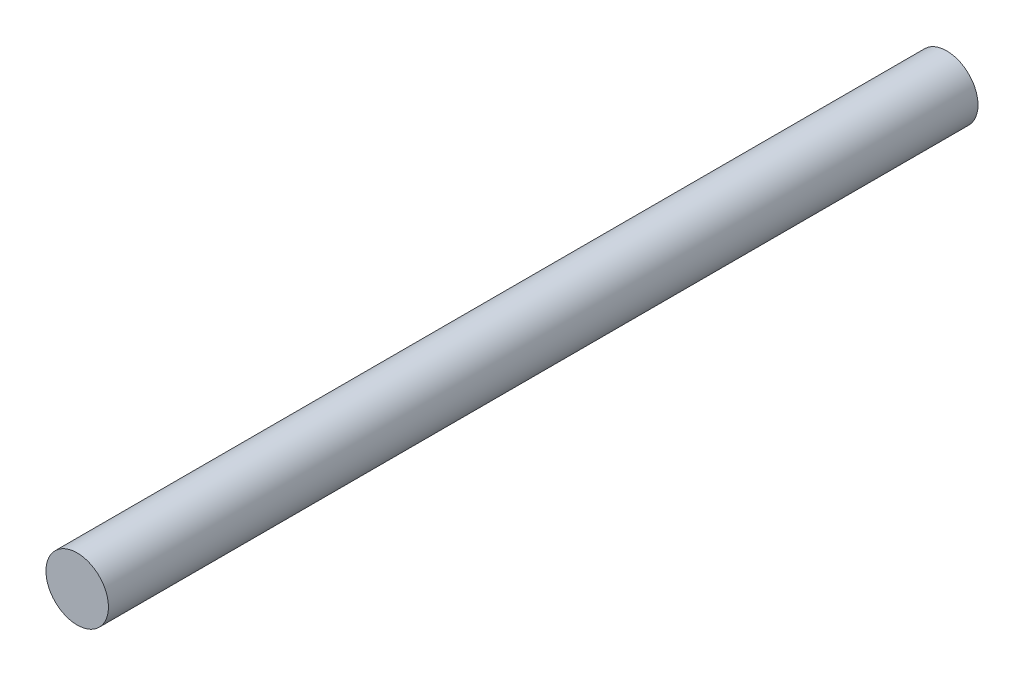
ISO-10303-21;
HEADER;
FILE_DESCRIPTION(('STEP AP214'),'2;1');
FILE_NAME('part.step','',(''),(''),'','','');
FILE_SCHEMA(('AUTOMOTIVE_DESIGN { 1 0 10303 214 1 1 1 1 }'));
ENDSEC;
DATA;
#1=APPLICATION_CONTEXT('core data for automotive mechanical design processes');
#2=APPLICATION_PROTOCOL_DEFINITION('international standard','automotive_design',2000,#1);
#3=PRODUCT_CONTEXT('',#1,'mechanical');
#4=PRODUCT('Part','Part','',(#3));
#5=PRODUCT_RELATED_PRODUCT_CATEGORY('part','',(#4));
#6=PRODUCT_DEFINITION_FORMATION('','',#4);
#7=PRODUCT_DEFINITION_CONTEXT('part definition',#1,'design');
#8=PRODUCT_DEFINITION('design','',#6,#7);
#9=PRODUCT_DEFINITION_SHAPE('','',#8);
#10=(LENGTH_UNIT() NAMED_UNIT(*) SI_UNIT(.MILLI.,.METRE.));
#11=(NAMED_UNIT(*) PLANE_ANGLE_UNIT() SI_UNIT($,.RADIAN.));
#12=(NAMED_UNIT(*) SI_UNIT($,.STERADIAN.) SOLID_ANGLE_UNIT());
#13=UNCERTAINTY_MEASURE_WITH_UNIT(LENGTH_MEASURE(1.E-05),#10,'distance_accuracy_value','');
#14=(GEOMETRIC_REPRESENTATION_CONTEXT(3) GLOBAL_UNCERTAINTY_ASSIGNED_CONTEXT((#13)) GLOBAL_UNIT_ASSIGNED_CONTEXT((#10,
#11,#12)) REPRESENTATION_CONTEXT('',''));
#15=CARTESIAN_POINT('',(0.,0.,0.));
#16=DIRECTION('',(0.,0.,1.));
#17=DIRECTION('',(1.,0.,0.));
#18=AXIS2_PLACEMENT_3D('',#15,#16,#17);
#19=CARTESIAN_POINT('',(0.,0.,80.));
#20=DIRECTION('',(0.,0.,-1.));
#21=DIRECTION('',(-1.,0.,0.));
#22=AXIS2_PLACEMENT_3D('',#19,#20,#21);
#23=CYLINDRICAL_SURFACE('',#22,2.875);
#24=CARTESIAN_POINT('',(0.,0.,80.));
#25=DIRECTION('',(0.,0.,1.));
#26=DIRECTION('',(1.,0.,0.));
#27=AXIS2_PLACEMENT_3D('',#24,#25,#26);
#28=CIRCLE('',#27,2.875);
#29=CARTESIAN_POINT('',(2.875,0.,80.));
#30=VERTEX_POINT('',#29);
#31=EDGE_CURVE('E10',#30,#30,#28,.T.);
#32=ORIENTED_EDGE('',*,*,#31,.F.);
#33=EDGE_LOOP('',(#32));
#34=FACE_BOUND('',#33,.T.);
#35=CARTESIAN_POINT('',(0.,0.,0.));
#36=DIRECTION('',(0.,0.,1.));
#37=DIRECTION('',(1.,0.,0.));
#38=AXIS2_PLACEMENT_3D('',#35,#36,#37);
#39=CIRCLE('',#38,2.875);
#40=CARTESIAN_POINT('',(2.875,0.,0.));
#41=VERTEX_POINT('',#40);
#42=EDGE_CURVE('E40',#41,#41,#39,.T.);
#43=ORIENTED_EDGE('',*,*,#42,.T.);
#44=EDGE_LOOP('',(#43));
#45=FACE_BOUND('',#44,.T.);
#46=ADVANCED_FACE('F37',(#34,#45),#23,.T.);
#47=CARTESIAN_POINT('',(0.,0.,80.));
#48=DIRECTION('',(0.,0.,1.));
#49=DIRECTION('',(1.,0.,0.));
#50=AXIS2_PLACEMENT_3D('',#47,#48,#49);
#51=PLANE('',#50);
#52=ORIENTED_EDGE('',*,*,#31,.T.);
#53=EDGE_LOOP('',(#52));
#54=FACE_BOUND('',#53,.T.);
#55=ADVANCED_FACE('F54',(#54),#51,.T.);
#56=CARTESIAN_POINT('',(0.,0.,0.));
#57=DIRECTION('',(0.,0.,1.));
#58=DIRECTION('',(1.,0.,0.));
#59=AXIS2_PLACEMENT_3D('',#56,#57,#58);
#60=PLANE('',#59);
#61=ORIENTED_EDGE('',*,*,#42,.F.);
#62=EDGE_LOOP('',(#61));
#63=FACE_BOUND('',#62,.T.);
#64=ADVANCED_FACE('F52',(#63),#60,.F.);
#65=CLOSED_SHELL('',(#46,#55,#64));
#66=MANIFOLD_SOLID_BREP('B2',#65);
#67=ADVANCED_BREP_SHAPE_REPRESENTATION('',(#18,#66),#14);
#68=SHAPE_DEFINITION_REPRESENTATION(#9,#67);
ENDSEC;
END-ISO-10303-21;
